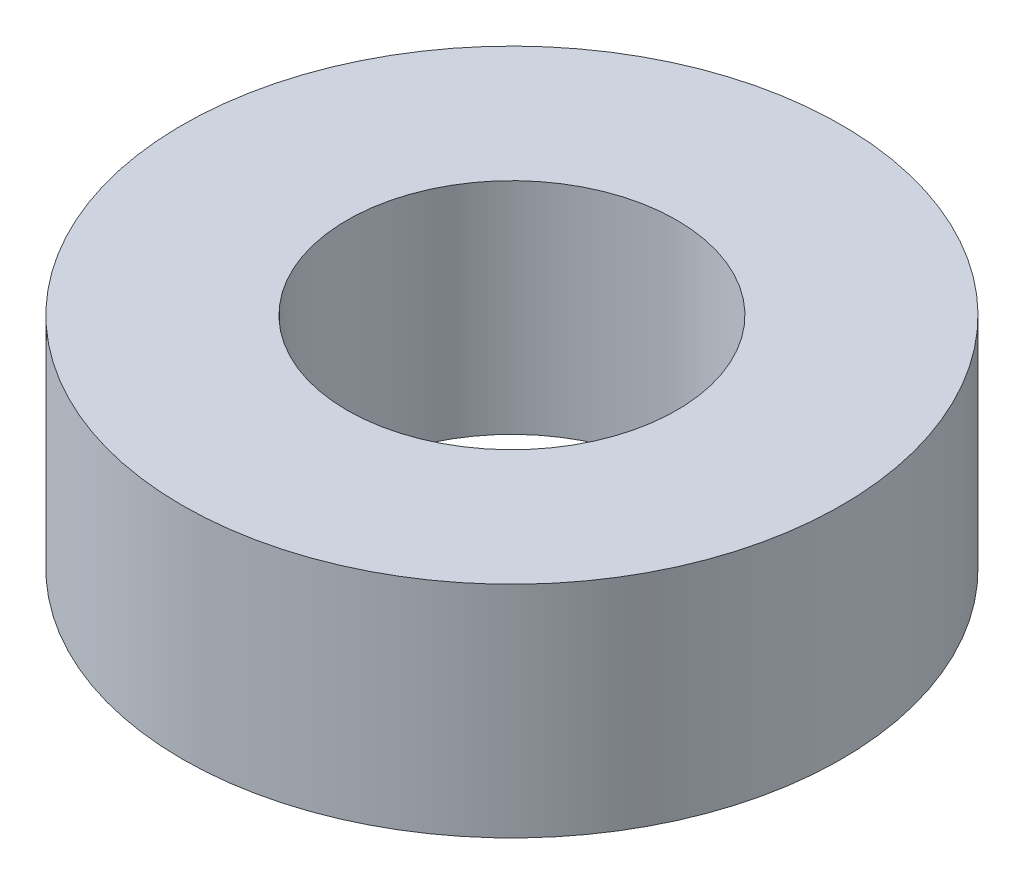
ISO-10303-21;
HEADER;
FILE_DESCRIPTION(('STEP AP214'),'2;1');
FILE_NAME('part.step','',(''),(''),'','','');
FILE_SCHEMA(('AUTOMOTIVE_DESIGN { 1 0 10303 214 1 1 1 1 }'));
ENDSEC;
DATA;
#1=APPLICATION_CONTEXT('core data for automotive mechanical design processes');
#2=APPLICATION_PROTOCOL_DEFINITION('international standard','automotive_design',2000,#1);
#3=PRODUCT_CONTEXT('',#1,'mechanical');
#4=PRODUCT('Part','Part','',(#3));
#5=PRODUCT_RELATED_PRODUCT_CATEGORY('part','',(#4));
#6=PRODUCT_DEFINITION_FORMATION('','',#4);
#7=PRODUCT_DEFINITION_CONTEXT('part definition',#1,'design');
#8=PRODUCT_DEFINITION('design','',#6,#7);
#9=PRODUCT_DEFINITION_SHAPE('','',#8);
#10=(LENGTH_UNIT() NAMED_UNIT(*) SI_UNIT(.MILLI.,.METRE.));
#11=(NAMED_UNIT(*) PLANE_ANGLE_UNIT() SI_UNIT($,.RADIAN.));
#12=(NAMED_UNIT(*) SI_UNIT($,.STERADIAN.) SOLID_ANGLE_UNIT());
#13=UNCERTAINTY_MEASURE_WITH_UNIT(LENGTH_MEASURE(1.E-05),#10,'distance_accuracy_value','');
#14=(GEOMETRIC_REPRESENTATION_CONTEXT(3) GLOBAL_UNCERTAINTY_ASSIGNED_CONTEXT((#13)) GLOBAL_UNIT_ASSIGNED_CONTEXT((#10,
#11,#12)) REPRESENTATION_CONTEXT('',''));
#15=CARTESIAN_POINT('',(0.,0.,0.));
#16=DIRECTION('',(0.,0.,1.));
#17=DIRECTION('',(1.,0.,0.));
#18=AXIS2_PLACEMENT_3D('',#15,#16,#17);
#19=CARTESIAN_POINT('',(0.,3.175,0.));
#20=DIRECTION('',(0.,1.,0.));
#21=DIRECTION('',(0.,0.,1.));
#22=AXIS2_PLACEMENT_3D('',#19,#20,#21);
#23=PLANE('',#22);
#24=CARTESIAN_POINT('',(0.,3.175,0.));
#25=DIRECTION('',(0.,1.,0.));
#26=DIRECTION('',(0.,0.,1.));
#27=AXIS2_PLACEMENT_3D('',#24,#25,#26);
#28=CIRCLE('',#27,4.7625);
#29=CARTESIAN_POINT('',(0.,3.175,4.7625));
#30=VERTEX_POINT('',#29);
#31=EDGE_CURVE('E10',#30,#30,#28,.T.);
#32=ORIENTED_EDGE('',*,*,#31,.T.);
#33=EDGE_LOOP('',(#32));
#34=FACE_BOUND('',#33,.T.);
#35=CARTESIAN_POINT('',(0.,3.175,0.));
#36=DIRECTION('',(0.,1.,0.));
#37=DIRECTION('',(0.,0.,1.));
#38=AXIS2_PLACEMENT_3D('',#35,#36,#37);
#39=CIRCLE('',#38,2.38125);
#40=CARTESIAN_POINT('',(0.,3.175,2.38125));
#41=VERTEX_POINT('',#40);
#42=EDGE_CURVE('E56',#41,#41,#39,.T.);
#43=ORIENTED_EDGE('',*,*,#42,.F.);
#44=EDGE_LOOP('',(#43));
#45=FACE_BOUND('',#44,.T.);
#46=ADVANCED_FACE('F43',(#34,#45),#23,.T.);
#47=CARTESIAN_POINT('',(0.,0.,0.));
#48=DIRECTION('',(0.,1.,0.));
#49=DIRECTION('',(0.,0.,1.));
#50=AXIS2_PLACEMENT_3D('',#47,#48,#49);
#51=PLANE('',#50);
#52=CARTESIAN_POINT('',(0.,0.,0.));
#53=DIRECTION('',(0.,1.,0.));
#54=DIRECTION('',(0.,0.,1.));
#55=AXIS2_PLACEMENT_3D('',#52,#53,#54);
#56=CIRCLE('',#55,4.7625);
#57=CARTESIAN_POINT('',(0.,0.,4.7625));
#58=VERTEX_POINT('',#57);
#59=EDGE_CURVE('E47',#58,#58,#56,.T.);
#60=ORIENTED_EDGE('',*,*,#59,.F.);
#61=EDGE_LOOP('',(#60));
#62=FACE_BOUND('',#61,.T.);
#63=CARTESIAN_POINT('',(0.,0.,0.));
#64=DIRECTION('',(0.,1.,0.));
#65=DIRECTION('',(0.,0.,1.));
#66=AXIS2_PLACEMENT_3D('',#63,#64,#65);
#67=CIRCLE('',#66,2.38125);
#68=CARTESIAN_POINT('',(0.,0.,2.38125));
#69=VERTEX_POINT('',#68);
#70=EDGE_CURVE('E58',#69,#69,#67,.T.);
#71=ORIENTED_EDGE('',*,*,#70,.T.);
#72=EDGE_LOOP('',(#71));
#73=FACE_BOUND('',#72,.T.);
#74=ADVANCED_FACE('F70',(#62,#73),#51,.F.);
#75=CARTESIAN_POINT('',(0.,3.175,0.));
#76=DIRECTION('',(0.,-1.,0.));
#77=DIRECTION('',(0.,0.,-1.));
#78=AXIS2_PLACEMENT_3D('',#75,#76,#77);
#79=CYLINDRICAL_SURFACE('',#78,4.7625);
#80=ORIENTED_EDGE('',*,*,#31,.F.);
#81=EDGE_LOOP('',(#80));
#82=FACE_BOUND('',#81,.T.);
#83=ORIENTED_EDGE('',*,*,#59,.T.);
#84=EDGE_LOOP('',(#83));
#85=FACE_BOUND('',#84,.T.);
#86=ADVANCED_FACE('F45',(#82,#85),#79,.T.);
#87=CARTESIAN_POINT('',(0.,3.175,0.));
#88=DIRECTION('',(0.,-1.,0.));
#89=DIRECTION('',(0.,0.,-1.));
#90=AXIS2_PLACEMENT_3D('',#87,#88,#89);
#91=CYLINDRICAL_SURFACE('',#90,2.38125);
#92=ORIENTED_EDGE('',*,*,#42,.T.);
#93=EDGE_LOOP('',(#92));
#94=FACE_BOUND('',#93,.T.);
#95=ORIENTED_EDGE('',*,*,#70,.F.);
#96=EDGE_LOOP('',(#95));
#97=FACE_BOUND('',#96,.T.);
#98=ADVANCED_FACE('F66',(#94,#97),#91,.F.);
#99=CLOSED_SHELL('',(#46,#74,#86,#98));
#100=MANIFOLD_SOLID_BREP('B2',#99);
#101=ADVANCED_BREP_SHAPE_REPRESENTATION('',(#18,#100),#14);
#102=SHAPE_DEFINITION_REPRESENTATION(#9,#101);
ENDSEC;
END-ISO-10303-21;
